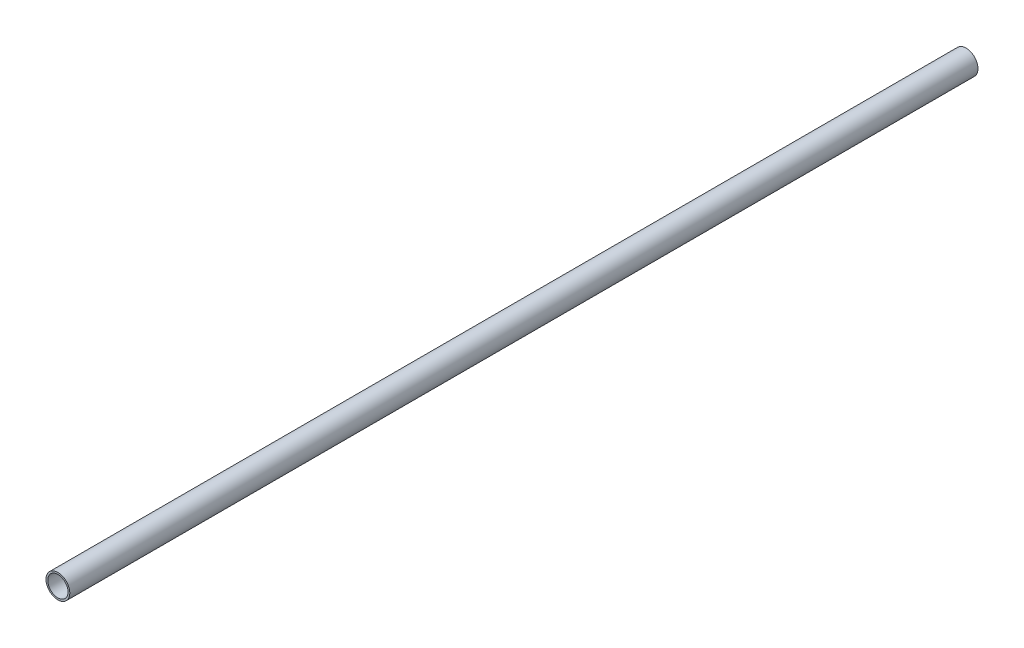
ISO-10303-21;
HEADER;
FILE_DESCRIPTION(('STEP AP214'),'2;1');
FILE_NAME('part.step','',(''),(''),'','','');
FILE_SCHEMA(('AUTOMOTIVE_DESIGN { 1 0 10303 214 1 1 1 1 }'));
ENDSEC;
DATA;
#1=APPLICATION_CONTEXT('core data for automotive mechanical design processes');
#2=APPLICATION_PROTOCOL_DEFINITION('international standard','automotive_design',2000,#1);
#3=PRODUCT_CONTEXT('',#1,'mechanical');
#4=PRODUCT('Part','Part','',(#3));
#5=PRODUCT_RELATED_PRODUCT_CATEGORY('part','',(#4));
#6=PRODUCT_DEFINITION_FORMATION('','',#4);
#7=PRODUCT_DEFINITION_CONTEXT('part definition',#1,'design');
#8=PRODUCT_DEFINITION('design','',#6,#7);
#9=PRODUCT_DEFINITION_SHAPE('','',#8);
#10=(LENGTH_UNIT() NAMED_UNIT(*) SI_UNIT(.MILLI.,.METRE.));
#11=(NAMED_UNIT(*) PLANE_ANGLE_UNIT() SI_UNIT($,.RADIAN.));
#12=(NAMED_UNIT(*) SI_UNIT($,.STERADIAN.) SOLID_ANGLE_UNIT());
#13=UNCERTAINTY_MEASURE_WITH_UNIT(LENGTH_MEASURE(1.E-05),#10,'distance_accuracy_value','');
#14=(GEOMETRIC_REPRESENTATION_CONTEXT(3) GLOBAL_UNCERTAINTY_ASSIGNED_CONTEXT((#13)) GLOBAL_UNIT_ASSIGNED_CONTEXT((#10,
#11,#12)) REPRESENTATION_CONTEXT('',''));
#15=CARTESIAN_POINT('',(0.,0.,0.));
#16=DIRECTION('',(0.,0.,1.));
#17=DIRECTION('',(1.,0.,0.));
#18=AXIS2_PLACEMENT_3D('',#15,#16,#17);
#19=CARTESIAN_POINT('',(0.,3.59663999999997,137.16));
#20=DIRECTION('',(0.,0.,-1.));
#21=DIRECTION('',(-1.,0.,0.));
#22=AXIS2_PLACEMENT_3D('',#19,#20,#21);
#23=PLANE('',#22);
#24=CARTESIAN_POINT('',(0.,0.,137.16));
#25=DIRECTION('',(0.,0.,1.));
#26=DIRECTION('',(1.,0.,0.));
#27=AXIS2_PLACEMENT_3D('',#24,#25,#26);
#28=CIRCLE('',#27,3.06323999999997);
#29=CARTESIAN_POINT('',(3.06323999999997,0.,137.16));
#30=VERTEX_POINT('',#29);
#31=EDGE_CURVE('E10',#30,#30,#28,.T.);
#32=ORIENTED_EDGE('',*,*,#31,.F.);
#33=EDGE_LOOP('',(#32));
#34=FACE_BOUND('',#33,.T.);
#35=CARTESIAN_POINT('',(0.,0.,137.16));
#36=DIRECTION('',(0.,0.,1.));
#37=DIRECTION('',(1.,0.,0.));
#38=AXIS2_PLACEMENT_3D('',#35,#36,#37);
#39=CIRCLE('',#38,3.59663999999997);
#40=CARTESIAN_POINT('',(3.59663999999997,0.,137.16));
#41=VERTEX_POINT('',#40);
#42=EDGE_CURVE('E47',#41,#41,#39,.T.);
#43=ORIENTED_EDGE('',*,*,#42,.T.);
#44=EDGE_LOOP('',(#43));
#45=FACE_BOUND('',#44,.T.);
#46=ADVANCED_FACE('F33',(#34,#45),#23,.F.);
#47=CARTESIAN_POINT('',(0.,0.,45.9221927837305));
#48=DIRECTION('',(0.,0.,1.));
#49=DIRECTION('',(1.,0.,0.));
#50=AXIS2_PLACEMENT_3D('',#47,#48,#49);
#51=CYLINDRICAL_SURFACE('',#50,3.06323999999997);
#52=CARTESIAN_POINT('',(0.,0.,-137.16));
#53=DIRECTION('',(0.,0.,1.));
#54=DIRECTION('',(1.,0.,0.));
#55=AXIS2_PLACEMENT_3D('',#52,#53,#54);
#56=CIRCLE('',#55,3.06323999999997);
#57=CARTESIAN_POINT('',(3.06323999999997,0.,-137.16));
#58=VERTEX_POINT('',#57);
#59=EDGE_CURVE('E39',#58,#58,#56,.T.);
#60=ORIENTED_EDGE('',*,*,#59,.F.);
#61=EDGE_LOOP('',(#60));
#62=FACE_BOUND('',#61,.T.);
#63=ORIENTED_EDGE('',*,*,#31,.T.);
#64=EDGE_LOOP('',(#63));
#65=FACE_BOUND('',#64,.T.);
#66=ADVANCED_FACE('F62',(#62,#65),#51,.F.);
#67=CARTESIAN_POINT('',(0.,3.06323999999997,-137.16));
#68=DIRECTION('',(0.,0.,1.));
#69=DIRECTION('',(1.,0.,0.));
#70=AXIS2_PLACEMENT_3D('',#67,#68,#69);
#71=PLANE('',#70);
#72=CARTESIAN_POINT('',(0.,0.,-137.16));
#73=DIRECTION('',(0.,0.,1.));
#74=DIRECTION('',(1.,0.,0.));
#75=AXIS2_PLACEMENT_3D('',#72,#73,#74);
#76=CIRCLE('',#75,3.59664);
#77=CARTESIAN_POINT('',(3.59664,0.,-137.16));
#78=VERTEX_POINT('',#77);
#79=EDGE_CURVE('E43',#78,#78,#76,.T.);
#80=ORIENTED_EDGE('',*,*,#79,.F.);
#81=EDGE_LOOP('',(#80));
#82=FACE_BOUND('',#81,.T.);
#83=ORIENTED_EDGE('',*,*,#59,.T.);
#84=EDGE_LOOP('',(#83));
#85=FACE_BOUND('',#84,.T.);
#86=ADVANCED_FACE('F57',(#82,#85),#71,.F.);
#87=CARTESIAN_POINT('',(0.,0.,45.9221927837305));
#88=DIRECTION('',(0.,0.,1.));
#89=DIRECTION('',(1.,0.,0.));
#90=AXIS2_PLACEMENT_3D('',#87,#88,#89);
#91=CYLINDRICAL_SURFACE('',#90,3.59663999999998);
#92=ORIENTED_EDGE('',*,*,#42,.F.);
#93=EDGE_LOOP('',(#92));
#94=FACE_BOUND('',#93,.T.);
#95=ORIENTED_EDGE('',*,*,#79,.T.);
#96=EDGE_LOOP('',(#95));
#97=FACE_BOUND('',#96,.T.);
#98=ADVANCED_FACE('F54',(#94,#97),#91,.T.);
#99=CLOSED_SHELL('',(#46,#66,#86,#98));
#100=MANIFOLD_SOLID_BREP('B2',#99);
#101=ADVANCED_BREP_SHAPE_REPRESENTATION('',(#18,#100),#14);
#102=SHAPE_DEFINITION_REPRESENTATION(#9,#101);
ENDSEC;
END-ISO-10303-21;
